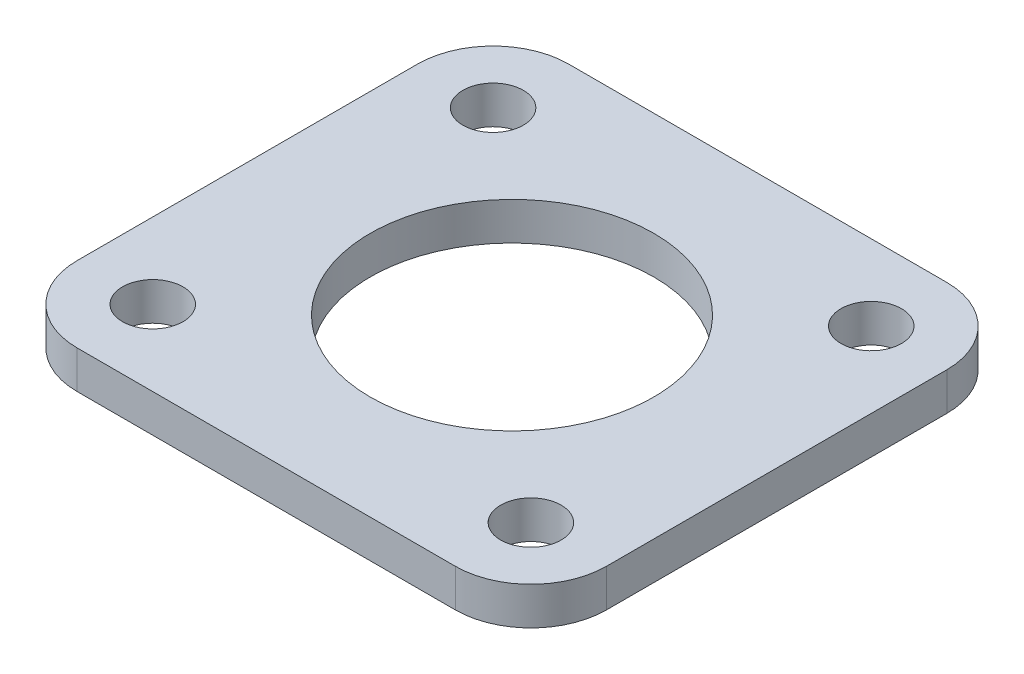
ISO-10303-21;
HEADER;
FILE_DESCRIPTION(('STEP AP214'),'2;1');
FILE_NAME('part.step','',(''),(''),'','','');
FILE_SCHEMA(('AUTOMOTIVE_DESIGN { 1 0 10303 214 1 1 1 1 }'));
ENDSEC;
DATA;
#1=APPLICATION_CONTEXT('core data for automotive mechanical design processes');
#2=APPLICATION_PROTOCOL_DEFINITION('international standard','automotive_design',2000,#1);
#3=PRODUCT_CONTEXT('',#1,'mechanical');
#4=PRODUCT('Part','Part','',(#3));
#5=PRODUCT_RELATED_PRODUCT_CATEGORY('part','',(#4));
#6=PRODUCT_DEFINITION_FORMATION('','',#4);
#7=PRODUCT_DEFINITION_CONTEXT('part definition',#1,'design');
#8=PRODUCT_DEFINITION('design','',#6,#7);
#9=PRODUCT_DEFINITION_SHAPE('','',#8);
#10=(LENGTH_UNIT() NAMED_UNIT(*) SI_UNIT(.MILLI.,.METRE.));
#11=(NAMED_UNIT(*) PLANE_ANGLE_UNIT() SI_UNIT($,.RADIAN.));
#12=(NAMED_UNIT(*) SI_UNIT($,.STERADIAN.) SOLID_ANGLE_UNIT());
#13=UNCERTAINTY_MEASURE_WITH_UNIT(LENGTH_MEASURE(1.E-05),#10,'distance_accuracy_value','');
#14=(GEOMETRIC_REPRESENTATION_CONTEXT(3) GLOBAL_UNCERTAINTY_ASSIGNED_CONTEXT((#13)) GLOBAL_UNIT_ASSIGNED_CONTEXT((#10,
#11,#12)) REPRESENTATION_CONTEXT('',''));
#15=CARTESIAN_POINT('',(0.,0.,0.));
#16=DIRECTION('',(0.,0.,1.));
#17=DIRECTION('',(1.,0.,0.));
#18=AXIS2_PLACEMENT_3D('',#15,#16,#17);
#19=CARTESIAN_POINT('',(0.,2.,0.));
#20=DIRECTION('',(0.,1.,0.));
#21=DIRECTION('',(0.,0.,1.));
#22=AXIS2_PLACEMENT_3D('',#19,#20,#21);
#23=PLANE('',#22);
#24=CARTESIAN_POINT('',(0.,2.,0.));
#25=DIRECTION('',(0.,1.,0.));
#26=DIRECTION('',(0.,0.,1.));
#27=AXIS2_PLACEMENT_3D('',#24,#25,#26);
#28=CIRCLE('',#27,7.5);
#29=CARTESIAN_POINT('',(0.,2.,7.5));
#30=VERTEX_POINT('',#29);
#31=EDGE_CURVE('E199',#30,#30,#28,.T.);
#32=ORIENTED_EDGE('',*,*,#31,.F.);
#33=EDGE_LOOP('',(#32));
#34=FACE_BOUND('',#33,.T.);
#35=CARTESIAN_POINT('',(-10.,2.,-9.));
#36=DIRECTION('',(0.,1.,0.));
#37=DIRECTION('',(0.,0.,1.));
#38=AXIS2_PLACEMENT_3D('',#35,#36,#37);
#39=CIRCLE('',#38,1.6);
#40=CARTESIAN_POINT('',(-10.,2.,-7.4));
#41=VERTEX_POINT('',#40);
#42=EDGE_CURVE('E184',#41,#41,#39,.T.);
#43=ORIENTED_EDGE('',*,*,#42,.F.);
#44=EDGE_LOOP('',(#43));
#45=FACE_BOUND('',#44,.T.);
#46=CARTESIAN_POINT('',(10.,2.,9.00000000000001));
#47=DIRECTION('',(0.,1.,0.));
#48=DIRECTION('',(0.,0.,1.));
#49=AXIS2_PLACEMENT_3D('',#46,#47,#48);
#50=CIRCLE('',#49,1.6);
#51=CARTESIAN_POINT('',(10.,2.,10.6));
#52=VERTEX_POINT('',#51);
#53=EDGE_CURVE('E167',#52,#52,#50,.T.);
#54=ORIENTED_EDGE('',*,*,#53,.F.);
#55=EDGE_LOOP('',(#54));
#56=FACE_BOUND('',#55,.T.);
#57=DIRECTION('',(0.,0.,1.));
#58=VECTOR('',#57,1.);
#59=CARTESIAN_POINT('',(-14.,2.,-13.));
#60=LINE('',#59,#58);
#61=CARTESIAN_POINT('',(-14.,2.,-8.99999999999999));
#62=VERTEX_POINT('',#61);
#63=CARTESIAN_POINT('',(-14.,2.,9.));
#64=VERTEX_POINT('',#63);
#65=EDGE_CURVE('E174',#62,#64,#60,.T.);
#66=ORIENTED_EDGE('',*,*,#65,.T.);
#67=CARTESIAN_POINT('',(-9.99999999999999,2.,9.));
#68=DIRECTION('',(0.,1.,0.));
#69=DIRECTION('',(0.,0.,1.));
#70=AXIS2_PLACEMENT_3D('',#67,#68,#69);
#71=CIRCLE('',#70,4.);
#72=CARTESIAN_POINT('',(-9.99999999999999,2.,13.));
#73=VERTEX_POINT('',#72);
#74=EDGE_CURVE('E151',#64,#73,#71,.T.);
#75=ORIENTED_EDGE('',*,*,#74,.T.);
#76=DIRECTION('',(1.,0.,0.));
#77=VECTOR('',#76,1.);
#78=CARTESIAN_POINT('',(-14.,2.,13.));
#79=LINE('',#78,#77);
#80=CARTESIAN_POINT('',(10.,2.,13.));
#81=VERTEX_POINT('',#80);
#82=EDGE_CURVE('E122',#73,#81,#79,.T.);
#83=ORIENTED_EDGE('',*,*,#82,.T.);
#84=CARTESIAN_POINT('',(10.,2.,9.));
#85=DIRECTION('',(0.,1.,0.));
#86=DIRECTION('',(0.,0.,1.));
#87=AXIS2_PLACEMENT_3D('',#84,#85,#86);
#88=CIRCLE('',#87,4.);
#89=CARTESIAN_POINT('',(14.,2.,9.));
#90=VERTEX_POINT('',#89);
#91=EDGE_CURVE('E146',#81,#90,#88,.T.);
#92=ORIENTED_EDGE('',*,*,#91,.T.);
#93=DIRECTION('',(0.,0.,-1.));
#94=VECTOR('',#93,1.);
#95=CARTESIAN_POINT('',(14.,2.,-13.));
#96=LINE('',#95,#94);
#97=CARTESIAN_POINT('',(14.,2.,-8.99999999999999));
#98=VERTEX_POINT('',#97);
#99=EDGE_CURVE('E129',#90,#98,#96,.T.);
#100=ORIENTED_EDGE('',*,*,#99,.T.);
#101=CARTESIAN_POINT('',(10.,2.,-8.99999999999999));
#102=DIRECTION('',(0.,1.,0.));
#103=DIRECTION('',(0.,0.,1.));
#104=AXIS2_PLACEMENT_3D('',#101,#102,#103);
#105=CIRCLE('',#104,4.);
#106=CARTESIAN_POINT('',(10.,2.,-13.));
#107=VERTEX_POINT('',#106);
#108=EDGE_CURVE('E58',#98,#107,#105,.T.);
#109=ORIENTED_EDGE('',*,*,#108,.T.);
#110=DIRECTION('',(-1.,0.,0.));
#111=VECTOR('',#110,1.);
#112=CARTESIAN_POINT('',(-14.,2.,-13.));
#113=LINE('',#112,#111);
#114=CARTESIAN_POINT('',(-9.99999999999999,2.,-13.));
#115=VERTEX_POINT('',#114);
#116=EDGE_CURVE('E132',#107,#115,#113,.T.);
#117=ORIENTED_EDGE('',*,*,#116,.T.);
#118=CARTESIAN_POINT('',(-9.99999999999999,2.,-8.99999999999999));
#119=DIRECTION('',(0.,1.,0.));
#120=DIRECTION('',(0.,0.,1.));
#121=AXIS2_PLACEMENT_3D('',#118,#119,#120);
#122=CIRCLE('',#121,4.);
#123=EDGE_CURVE('E149',#115,#62,#122,.T.);
#124=ORIENTED_EDGE('',*,*,#123,.T.);
#125=EDGE_LOOP('',(#66,#75,#83,#92,#100,#109,#117,#124));
#126=FACE_BOUND('',#125,.T.);
#127=CARTESIAN_POINT('',(-9.99999999999999,2.,9.00000000000001));
#128=DIRECTION('',(0.,1.,0.));
#129=DIRECTION('',(0.,0.,1.));
#130=AXIS2_PLACEMENT_3D('',#127,#128,#129);
#131=CIRCLE('',#130,1.6);
#132=CARTESIAN_POINT('',(-9.99999999999999,2.,10.6));
#133=VERTEX_POINT('',#132);
#134=EDGE_CURVE('E179',#133,#133,#131,.T.);
#135=ORIENTED_EDGE('',*,*,#134,.F.);
#136=EDGE_LOOP('',(#135));
#137=FACE_BOUND('',#136,.T.);
#138=CARTESIAN_POINT('',(10.,2.,-8.99999999999999));
#139=DIRECTION('',(0.,1.,0.));
#140=DIRECTION('',(0.,0.,1.));
#141=AXIS2_PLACEMENT_3D('',#138,#139,#140);
#142=CIRCLE('',#141,1.6);
#143=CARTESIAN_POINT('',(10.,2.,-7.39999999999999));
#144=VERTEX_POINT('',#143);
#145=EDGE_CURVE('E190',#144,#144,#142,.T.);
#146=ORIENTED_EDGE('',*,*,#145,.F.);
#147=EDGE_LOOP('',(#146));
#148=FACE_BOUND('',#147,.T.);
#149=ADVANCED_FACE('F36',(#34,#45,#56,#126,#137,#148),#23,.T.);
#150=CARTESIAN_POINT('',(0.,0.,0.));
#151=DIRECTION('',(0.,1.,0.));
#152=DIRECTION('',(0.,0.,1.));
#153=AXIS2_PLACEMENT_3D('',#150,#151,#152);
#154=PLANE('',#153);
#155=CARTESIAN_POINT('',(0.,0.,0.));
#156=DIRECTION('',(0.,1.,0.));
#157=DIRECTION('',(0.,0.,1.));
#158=AXIS2_PLACEMENT_3D('',#155,#156,#157);
#159=CIRCLE('',#158,7.5);
#160=CARTESIAN_POINT('',(0.,0.,7.5));
#161=VERTEX_POINT('',#160);
#162=EDGE_CURVE('E196',#161,#161,#159,.T.);
#163=ORIENTED_EDGE('',*,*,#162,.T.);
#164=EDGE_LOOP('',(#163));
#165=FACE_BOUND('',#164,.T.);
#166=DIRECTION('',(1.,0.,0.));
#167=VECTOR('',#166,1.);
#168=CARTESIAN_POINT('',(-14.,0.,13.));
#169=LINE('',#168,#167);
#170=CARTESIAN_POINT('',(-9.99999999999999,0.,13.));
#171=VERTEX_POINT('',#170);
#172=CARTESIAN_POINT('',(10.,0.,13.));
#173=VERTEX_POINT('',#172);
#174=EDGE_CURVE('E119',#171,#173,#169,.T.);
#175=ORIENTED_EDGE('',*,*,#174,.F.);
#176=CARTESIAN_POINT('',(-9.99999999999999,0.,9.));
#177=DIRECTION('',(0.,1.,0.));
#178=DIRECTION('',(0.,0.,1.));
#179=AXIS2_PLACEMENT_3D('',#176,#177,#178);
#180=CIRCLE('',#179,4.);
#181=CARTESIAN_POINT('',(-14.,0.,9.));
#182=VERTEX_POINT('',#181);
#183=EDGE_CURVE('E102',#171,#182,#180,.F.);
#184=ORIENTED_EDGE('',*,*,#183,.T.);
#185=DIRECTION('',(0.,0.,1.));
#186=VECTOR('',#185,1.);
#187=CARTESIAN_POINT('',(-14.,0.,-13.));
#188=LINE('',#187,#186);
#189=CARTESIAN_POINT('',(-14.,0.,-8.99999999999999));
#190=VERTEX_POINT('',#189);
#191=EDGE_CURVE('E130',#190,#182,#188,.T.);
#192=ORIENTED_EDGE('',*,*,#191,.F.);
#193=CARTESIAN_POINT('',(-9.99999999999999,0.,-8.99999999999999));
#194=DIRECTION('',(0.,1.,0.));
#195=DIRECTION('',(0.,0.,1.));
#196=AXIS2_PLACEMENT_3D('',#193,#194,#195);
#197=CIRCLE('',#196,4.);
#198=CARTESIAN_POINT('',(-9.99999999999999,0.,-13.));
#199=VERTEX_POINT('',#198);
#200=EDGE_CURVE('E113',#190,#199,#197,.F.);
#201=ORIENTED_EDGE('',*,*,#200,.T.);
#202=DIRECTION('',(-1.,0.,0.));
#203=VECTOR('',#202,1.);
#204=CARTESIAN_POINT('',(-14.,0.,-13.));
#205=LINE('',#204,#203);
#206=CARTESIAN_POINT('',(10.,0.,-13.));
#207=VERTEX_POINT('',#206);
#208=EDGE_CURVE('E134',#207,#199,#205,.T.);
#209=ORIENTED_EDGE('',*,*,#208,.F.);
#210=CARTESIAN_POINT('',(10.,0.,-8.99999999999999));
#211=DIRECTION('',(0.,1.,0.));
#212=DIRECTION('',(0.,0.,1.));
#213=AXIS2_PLACEMENT_3D('',#210,#211,#212);
#214=CIRCLE('',#213,4.);
#215=CARTESIAN_POINT('',(14.,0.,-8.99999999999999));
#216=VERTEX_POINT('',#215);
#217=EDGE_CURVE('E140',#207,#216,#214,.F.);
#218=ORIENTED_EDGE('',*,*,#217,.T.);
#219=DIRECTION('',(0.,0.,-1.));
#220=VECTOR('',#219,1.);
#221=CARTESIAN_POINT('',(14.,0.,-13.));
#222=LINE('',#221,#220);
#223=CARTESIAN_POINT('',(14.,0.,9.));
#224=VERTEX_POINT('',#223);
#225=EDGE_CURVE('E162',#224,#216,#222,.T.);
#226=ORIENTED_EDGE('',*,*,#225,.F.);
#227=CARTESIAN_POINT('',(10.,0.,9.));
#228=DIRECTION('',(0.,1.,0.));
#229=DIRECTION('',(0.,0.,1.));
#230=AXIS2_PLACEMENT_3D('',#227,#228,#229);
#231=CIRCLE('',#230,4.);
#232=EDGE_CURVE('E123',#224,#173,#231,.F.);
#233=ORIENTED_EDGE('',*,*,#232,.T.);
#234=EDGE_LOOP('',(#175,#184,#192,#201,#209,#218,#226,#233));
#235=FACE_BOUND('',#234,.T.);
#236=CARTESIAN_POINT('',(10.,0.,9.00000000000001));
#237=DIRECTION('',(0.,1.,0.));
#238=DIRECTION('',(0.,0.,1.));
#239=AXIS2_PLACEMENT_3D('',#236,#237,#238);
#240=CIRCLE('',#239,1.6);
#241=CARTESIAN_POINT('',(10.,0.,10.6));
#242=VERTEX_POINT('',#241);
#243=EDGE_CURVE('E170',#242,#242,#240,.T.);
#244=ORIENTED_EDGE('',*,*,#243,.T.);
#245=EDGE_LOOP('',(#244));
#246=FACE_BOUND('',#245,.T.);
#247=CARTESIAN_POINT('',(-9.99999999999999,0.,9.00000000000001));
#248=DIRECTION('',(0.,1.,0.));
#249=DIRECTION('',(0.,0.,1.));
#250=AXIS2_PLACEMENT_3D('',#247,#248,#249);
#251=CIRCLE('',#250,1.6);
#252=CARTESIAN_POINT('',(-9.99999999999999,0.,10.6));
#253=VERTEX_POINT('',#252);
#254=EDGE_CURVE('E181',#253,#253,#251,.T.);
#255=ORIENTED_EDGE('',*,*,#254,.T.);
#256=EDGE_LOOP('',(#255));
#257=FACE_BOUND('',#256,.T.);
#258=CARTESIAN_POINT('',(-10.,0.,-9.));
#259=DIRECTION('',(0.,1.,0.));
#260=DIRECTION('',(0.,0.,1.));
#261=AXIS2_PLACEMENT_3D('',#258,#259,#260);
#262=CIRCLE('',#261,1.6);
#263=CARTESIAN_POINT('',(-10.,0.,-7.4));
#264=VERTEX_POINT('',#263);
#265=EDGE_CURVE('E187',#264,#264,#262,.T.);
#266=ORIENTED_EDGE('',*,*,#265,.T.);
#267=EDGE_LOOP('',(#266));
#268=FACE_BOUND('',#267,.T.);
#269=CARTESIAN_POINT('',(10.,0.,-8.99999999999999));
#270=DIRECTION('',(0.,1.,0.));
#271=DIRECTION('',(0.,0.,1.));
#272=AXIS2_PLACEMENT_3D('',#269,#270,#271);
#273=CIRCLE('',#272,1.6);
#274=CARTESIAN_POINT('',(10.,0.,-7.39999999999999));
#275=VERTEX_POINT('',#274);
#276=EDGE_CURVE('E193',#275,#275,#273,.T.);
#277=ORIENTED_EDGE('',*,*,#276,.T.);
#278=EDGE_LOOP('',(#277));
#279=FACE_BOUND('',#278,.T.);
#280=ADVANCED_FACE('F126',(#165,#235,#246,#257,#268,#279),#154,.F.);
#281=CARTESIAN_POINT('',(14.,2.,-13.));
#282=DIRECTION('',(-1.,0.,0.));
#283=DIRECTION('',(0.,0.,1.));
#284=AXIS2_PLACEMENT_3D('',#281,#282,#283);
#285=PLANE('',#284);
#286=ORIENTED_EDGE('',*,*,#225,.T.);
#287=DIRECTION('',(0.,-1.,0.));
#288=VECTOR('',#287,1.);
#289=CARTESIAN_POINT('',(14.,2.,-8.99999999999999));
#290=LINE('',#289,#288);
#291=EDGE_CURVE('E11',#216,#98,#290,.F.);
#292=ORIENTED_EDGE('',*,*,#291,.T.);
#293=ORIENTED_EDGE('',*,*,#99,.F.);
#294=DIRECTION('',(0.,-1.,0.));
#295=VECTOR('',#294,1.);
#296=CARTESIAN_POINT('',(14.,2.,9.));
#297=LINE('',#296,#295);
#298=EDGE_CURVE('E44',#90,#224,#297,.T.);
#299=ORIENTED_EDGE('',*,*,#298,.T.);
#300=EDGE_LOOP('',(#286,#292,#293,#299));
#301=FACE_BOUND('',#300,.T.);
#302=ADVANCED_FACE('F161',(#301),#285,.F.);
#303=CARTESIAN_POINT('',(-14.,2.,-13.));
#304=DIRECTION('',(0.,0.,1.));
#305=DIRECTION('',(1.,0.,0.));
#306=AXIS2_PLACEMENT_3D('',#303,#304,#305);
#307=PLANE('',#306);
#308=ORIENTED_EDGE('',*,*,#208,.T.);
#309=DIRECTION('',(0.,-1.,0.));
#310=VECTOR('',#309,1.);
#311=CARTESIAN_POINT('',(-9.99999999999999,2.,-13.));
#312=LINE('',#311,#310);
#313=EDGE_CURVE('E51',#199,#115,#312,.F.);
#314=ORIENTED_EDGE('',*,*,#313,.T.);
#315=ORIENTED_EDGE('',*,*,#116,.F.);
#316=DIRECTION('',(0.,-1.,0.));
#317=VECTOR('',#316,1.);
#318=CARTESIAN_POINT('',(10.,2.,-13.));
#319=LINE('',#318,#317);
#320=EDGE_CURVE('E153',#107,#207,#319,.T.);
#321=ORIENTED_EDGE('',*,*,#320,.T.);
#322=EDGE_LOOP('',(#308,#314,#315,#321));
#323=FACE_BOUND('',#322,.T.);
#324=ADVANCED_FACE('F236',(#323),#307,.F.);
#325=CARTESIAN_POINT('',(-14.,2.,-13.));
#326=DIRECTION('',(1.,0.,0.));
#327=DIRECTION('',(0.,0.,-1.));
#328=AXIS2_PLACEMENT_3D('',#325,#326,#327);
#329=PLANE('',#328);
#330=ORIENTED_EDGE('',*,*,#191,.T.);
#331=DIRECTION('',(0.,-1.,0.));
#332=VECTOR('',#331,1.);
#333=CARTESIAN_POINT('',(-14.,2.,9.));
#334=LINE('',#333,#332);
#335=EDGE_CURVE('E107',#182,#64,#334,.F.);
#336=ORIENTED_EDGE('',*,*,#335,.T.);
#337=ORIENTED_EDGE('',*,*,#65,.F.);
#338=DIRECTION('',(0.,-1.,0.));
#339=VECTOR('',#338,1.);
#340=CARTESIAN_POINT('',(-14.,2.,-8.99999999999999));
#341=LINE('',#340,#339);
#342=EDGE_CURVE('E112',#62,#190,#341,.T.);
#343=ORIENTED_EDGE('',*,*,#342,.T.);
#344=EDGE_LOOP('',(#330,#336,#337,#343));
#345=FACE_BOUND('',#344,.T.);
#346=ADVANCED_FACE('F243',(#345),#329,.F.);
#347=CARTESIAN_POINT('',(-14.,2.,13.));
#348=DIRECTION('',(0.,0.,-1.));
#349=DIRECTION('',(-1.,0.,0.));
#350=AXIS2_PLACEMENT_3D('',#347,#348,#349);
#351=PLANE('',#350);
#352=ORIENTED_EDGE('',*,*,#82,.F.);
#353=DIRECTION('',(0.,-1.,0.));
#354=VECTOR('',#353,1.);
#355=CARTESIAN_POINT('',(-9.99999999999999,2.,13.));
#356=LINE('',#355,#354);
#357=EDGE_CURVE('E106',#73,#171,#356,.T.);
#358=ORIENTED_EDGE('',*,*,#357,.T.);
#359=ORIENTED_EDGE('',*,*,#174,.T.);
#360=DIRECTION('',(0.,-1.,0.));
#361=VECTOR('',#360,1.);
#362=CARTESIAN_POINT('',(10.,2.,13.));
#363=LINE('',#362,#361);
#364=EDGE_CURVE('E124',#173,#81,#363,.F.);
#365=ORIENTED_EDGE('',*,*,#364,.T.);
#366=EDGE_LOOP('',(#352,#358,#359,#365));
#367=FACE_BOUND('',#366,.T.);
#368=ADVANCED_FACE('F118',(#367),#351,.F.);
#369=CARTESIAN_POINT('',(10.,2.,9.00000000000001));
#370=DIRECTION('',(0.,-1.,0.));
#371=DIRECTION('',(0.,0.,-1.));
#372=AXIS2_PLACEMENT_3D('',#369,#370,#371);
#373=CYLINDRICAL_SURFACE('',#372,1.6);
#374=ORIENTED_EDGE('',*,*,#53,.T.);
#375=EDGE_LOOP('',(#374));
#376=FACE_BOUND('',#375,.T.);
#377=ORIENTED_EDGE('',*,*,#243,.F.);
#378=EDGE_LOOP('',(#377));
#379=FACE_BOUND('',#378,.T.);
#380=ADVANCED_FACE('F242',(#376,#379),#373,.F.);
#381=CARTESIAN_POINT('',(-9.99999999999999,2.,9.00000000000001));
#382=DIRECTION('',(0.,-1.,0.));
#383=DIRECTION('',(0.,0.,-1.));
#384=AXIS2_PLACEMENT_3D('',#381,#382,#383);
#385=CYLINDRICAL_SURFACE('',#384,1.6);
#386=ORIENTED_EDGE('',*,*,#134,.T.);
#387=EDGE_LOOP('',(#386));
#388=FACE_BOUND('',#387,.T.);
#389=ORIENTED_EDGE('',*,*,#254,.F.);
#390=EDGE_LOOP('',(#389));
#391=FACE_BOUND('',#390,.T.);
#392=ADVANCED_FACE('F338',(#388,#391),#385,.F.);
#393=CARTESIAN_POINT('',(-10.,2.,-9.));
#394=DIRECTION('',(0.,-1.,0.));
#395=DIRECTION('',(0.,0.,-1.));
#396=AXIS2_PLACEMENT_3D('',#393,#394,#395);
#397=CYLINDRICAL_SURFACE('',#396,1.6);
#398=ORIENTED_EDGE('',*,*,#42,.T.);
#399=EDGE_LOOP('',(#398));
#400=FACE_BOUND('',#399,.T.);
#401=ORIENTED_EDGE('',*,*,#265,.F.);
#402=EDGE_LOOP('',(#401));
#403=FACE_BOUND('',#402,.T.);
#404=ADVANCED_FACE('F227',(#400,#403),#397,.F.);
#405=CARTESIAN_POINT('',(10.,2.,-8.99999999999999));
#406=DIRECTION('',(0.,-1.,0.));
#407=DIRECTION('',(0.,0.,-1.));
#408=AXIS2_PLACEMENT_3D('',#405,#406,#407);
#409=CYLINDRICAL_SURFACE('',#408,1.6);
#410=ORIENTED_EDGE('',*,*,#145,.T.);
#411=EDGE_LOOP('',(#410));
#412=FACE_BOUND('',#411,.T.);
#413=ORIENTED_EDGE('',*,*,#276,.F.);
#414=EDGE_LOOP('',(#413));
#415=FACE_BOUND('',#414,.T.);
#416=ADVANCED_FACE('F209',(#412,#415),#409,.F.);
#417=CARTESIAN_POINT('',(0.,0.,0.));
#418=DIRECTION('',(0.,1.,0.));
#419=DIRECTION('',(0.,0.,1.));
#420=AXIS2_PLACEMENT_3D('',#417,#418,#419);
#421=CYLINDRICAL_SURFACE('',#420,7.5);
#422=ORIENTED_EDGE('',*,*,#162,.F.);
#423=EDGE_LOOP('',(#422));
#424=FACE_BOUND('',#423,.T.);
#425=ORIENTED_EDGE('',*,*,#31,.T.);
#426=EDGE_LOOP('',(#425));
#427=FACE_BOUND('',#426,.T.);
#428=ADVANCED_FACE('F206',(#424,#427),#421,.F.);
#429=CARTESIAN_POINT('',(-9.99999999999999,2.,9.));
#430=DIRECTION('',(0.,-1.,0.));
#431=DIRECTION('',(0.,0.,-1.));
#432=AXIS2_PLACEMENT_3D('',#429,#430,#431);
#433=CYLINDRICAL_SURFACE('',#432,4.);
#434=ORIENTED_EDGE('',*,*,#74,.F.);
#435=ORIENTED_EDGE('',*,*,#335,.F.);
#436=ORIENTED_EDGE('',*,*,#183,.F.);
#437=ORIENTED_EDGE('',*,*,#357,.F.);
#438=EDGE_LOOP('',(#434,#435,#436,#437));
#439=FACE_BOUND('',#438,.T.);
#440=ADVANCED_FACE('F105',(#439),#433,.T.);
#441=CARTESIAN_POINT('',(-9.99999999999999,2.,-8.99999999999999));
#442=DIRECTION('',(0.,-1.,0.));
#443=DIRECTION('',(0.,0.,-1.));
#444=AXIS2_PLACEMENT_3D('',#441,#442,#443);
#445=CYLINDRICAL_SURFACE('',#444,4.);
#446=ORIENTED_EDGE('',*,*,#123,.F.);
#447=ORIENTED_EDGE('',*,*,#313,.F.);
#448=ORIENTED_EDGE('',*,*,#200,.F.);
#449=ORIENTED_EDGE('',*,*,#342,.F.);
#450=EDGE_LOOP('',(#446,#447,#448,#449));
#451=FACE_BOUND('',#450,.T.);
#452=ADVANCED_FACE('F251',(#451),#445,.T.);
#453=CARTESIAN_POINT('',(10.,2.,-8.99999999999999));
#454=DIRECTION('',(0.,-1.,0.));
#455=DIRECTION('',(0.,0.,-1.));
#456=AXIS2_PLACEMENT_3D('',#453,#454,#455);
#457=CYLINDRICAL_SURFACE('',#456,4.);
#458=ORIENTED_EDGE('',*,*,#108,.F.);
#459=ORIENTED_EDGE('',*,*,#291,.F.);
#460=ORIENTED_EDGE('',*,*,#217,.F.);
#461=ORIENTED_EDGE('',*,*,#320,.F.);
#462=EDGE_LOOP('',(#458,#459,#460,#461));
#463=FACE_BOUND('',#462,.T.);
#464=ADVANCED_FACE('F253',(#463),#457,.T.);
#465=CARTESIAN_POINT('',(10.,2.,9.));
#466=DIRECTION('',(0.,-1.,0.));
#467=DIRECTION('',(0.,0.,-1.));
#468=AXIS2_PLACEMENT_3D('',#465,#466,#467);
#469=CYLINDRICAL_SURFACE('',#468,4.);
#470=ORIENTED_EDGE('',*,*,#91,.F.);
#471=ORIENTED_EDGE('',*,*,#364,.F.);
#472=ORIENTED_EDGE('',*,*,#232,.F.);
#473=ORIENTED_EDGE('',*,*,#298,.F.);
#474=EDGE_LOOP('',(#470,#471,#472,#473));
#475=FACE_BOUND('',#474,.T.);
#476=ADVANCED_FACE('F38',(#475),#469,.T.);
#477=CLOSED_SHELL('',(#149,#280,#302,#324,#346,#368,#380,#392,#404,#416,#428,#440,#452,#464,#476));
#478=MANIFOLD_SOLID_BREP('B2',#477);
#479=ADVANCED_BREP_SHAPE_REPRESENTATION('',(#18,#478),#14);
#480=SHAPE_DEFINITION_REPRESENTATION(#9,#479);
ENDSEC;
END-ISO-10303-21;
